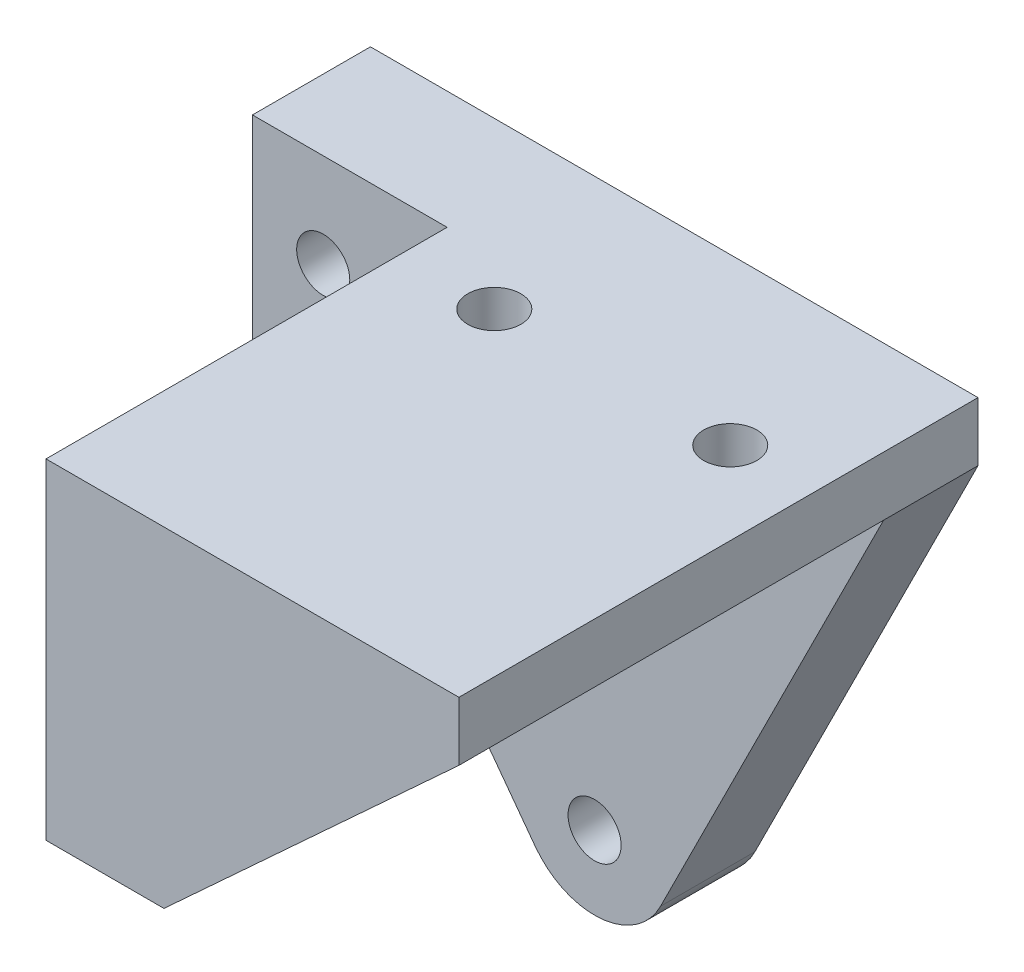
ISO-10303-21;
HEADER;
FILE_DESCRIPTION(('STEP AP214'),'2;1');
FILE_NAME('part.step','',(''),(''),'','','');
FILE_SCHEMA(('AUTOMOTIVE_DESIGN { 1 0 10303 214 1 1 1 1 }'));
ENDSEC;
DATA;
#1=APPLICATION_CONTEXT('core data for automotive mechanical design processes');
#2=APPLICATION_PROTOCOL_DEFINITION('international standard','automotive_design',2000,#1);
#3=PRODUCT_CONTEXT('',#1,'mechanical');
#4=PRODUCT('Part','Part','',(#3));
#5=PRODUCT_RELATED_PRODUCT_CATEGORY('part','',(#4));
#6=PRODUCT_DEFINITION_FORMATION('','',#4);
#7=PRODUCT_DEFINITION_CONTEXT('part definition',#1,'design');
#8=PRODUCT_DEFINITION('design','',#6,#7);
#9=PRODUCT_DEFINITION_SHAPE('','',#8);
#10=(LENGTH_UNIT() NAMED_UNIT(*) SI_UNIT(.MILLI.,.METRE.));
#11=(NAMED_UNIT(*) PLANE_ANGLE_UNIT() SI_UNIT($,.RADIAN.));
#12=(NAMED_UNIT(*) SI_UNIT($,.STERADIAN.) SOLID_ANGLE_UNIT());
#13=UNCERTAINTY_MEASURE_WITH_UNIT(LENGTH_MEASURE(1.E-05),#10,'distance_accuracy_value','');
#14=(GEOMETRIC_REPRESENTATION_CONTEXT(3) GLOBAL_UNCERTAINTY_ASSIGNED_CONTEXT((#13)) GLOBAL_UNIT_ASSIGNED_CONTEXT((#10,
#11,#12)) REPRESENTATION_CONTEXT('',''));
#15=CARTESIAN_POINT('',(0.,0.,0.));
#16=DIRECTION('',(0.,0.,1.));
#17=DIRECTION('',(1.,0.,0.));
#18=AXIS2_PLACEMENT_3D('',#15,#16,#17);
#19=CARTESIAN_POINT('',(0.,28.,0.));
#20=DIRECTION('',(-1.,0.,0.));
#21=DIRECTION('',(0.,0.,-1.));
#22=AXIS2_PLACEMENT_3D('',#19,#20,#21);
#23=PLANE('',#22);
#24=CARTESIAN_POINT('',(0.,17.5,34.));
#25=DIRECTION('',(-1.,0.,0.));
#26=DIRECTION('',(0.,0.,1.));
#27=AXIS2_PLACEMENT_3D('',#24,#25,#26);
#28=CIRCLE('',#27,2.25);
#29=CARTESIAN_POINT('',(0.,17.5,36.25));
#30=VERTEX_POINT('',#29);
#31=EDGE_CURVE('E263',#30,#30,#28,.T.);
#32=ORIENTED_EDGE('',*,*,#31,.T.);
#33=EDGE_LOOP('',(#32));
#34=FACE_BOUND('',#33,.T.);
#35=DIRECTION('',(0.,-1.,0.));
#36=VECTOR('',#35,1.);
#37=CARTESIAN_POINT('',(0.,23.,8.));
#38=LINE('',#37,#36);
#39=CARTESIAN_POINT('',(0.,23.,8.));
#40=VERTEX_POINT('',#39);
#41=CARTESIAN_POINT('',(0.,0.,8.));
#42=VERTEX_POINT('',#41);
#43=EDGE_CURVE('E357',#40,#42,#38,.T.);
#44=ORIENTED_EDGE('',*,*,#43,.F.);
#45=DIRECTION('',(0.,0.,1.));
#46=VECTOR('',#45,1.);
#47=CARTESIAN_POINT('',(0.,23.,0.));
#48=LINE('',#47,#46);
#49=CARTESIAN_POINT('',(0.,23.,10.5));
#50=VERTEX_POINT('',#49);
#51=EDGE_CURVE('E255',#40,#50,#48,.T.);
#52=ORIENTED_EDGE('',*,*,#51,.T.);
#53=DIRECTION('',(0.,-1.,0.));
#54=VECTOR('',#53,1.);
#55=CARTESIAN_POINT('',(0.,23.,10.5));
#56=LINE('',#55,#54);
#57=CARTESIAN_POINT('',(0.,18.,10.5));
#58=VERTEX_POINT('',#57);
#59=EDGE_CURVE('E219',#50,#58,#56,.T.);
#60=ORIENTED_EDGE('',*,*,#59,.T.);
#61=DIRECTION('',(0.,0.,1.));
#62=VECTOR('',#61,1.);
#63=CARTESIAN_POINT('',(0.,18.,10.5));
#64=LINE('',#63,#62);
#65=CARTESIAN_POINT('',(0.,18.,12.9692235935956));
#66=VERTEX_POINT('',#65);
#67=EDGE_CURVE('E224',#58,#66,#64,.T.);
#68=ORIENTED_EDGE('',*,*,#67,.T.);
#69=DIRECTION('',(0.,-1.,0.));
#70=VECTOR('',#69,1.);
#71=CARTESIAN_POINT('',(0.,28.00005,12.9692235935956));
#72=LINE('',#71,#70);
#73=CARTESIAN_POINT('',(0.,13.,12.9692235935956));
#74=VERTEX_POINT('',#73);
#75=EDGE_CURVE('E241',#74,#66,#72,.F.);
#76=ORIENTED_EDGE('',*,*,#75,.F.);
#77=DIRECTION('',(0.,0.,-1.));
#78=VECTOR('',#77,1.);
#79=CARTESIAN_POINT('',(0.,13.,0.));
#80=LINE('',#79,#78);
#81=CARTESIAN_POINT('',(0.,13.,15.0307764064044));
#82=VERTEX_POINT('',#81);
#83=EDGE_CURVE('E40',#82,#74,#80,.T.);
#84=ORIENTED_EDGE('',*,*,#83,.F.);
#85=DIRECTION('',(0.,-1.,0.));
#86=VECTOR('',#85,1.);
#87=CARTESIAN_POINT('',(0.,28.00005,15.0307764064044));
#88=LINE('',#87,#86);
#89=CARTESIAN_POINT('',(0.,18.,15.0307764064044));
#90=VERTEX_POINT('',#89);
#91=EDGE_CURVE('E244',#90,#82,#88,.T.);
#92=ORIENTED_EDGE('',*,*,#91,.F.);
#93=CARTESIAN_POINT('',(0.,18.,17.5));
#94=VERTEX_POINT('',#93);
#95=EDGE_CURVE('E222',#90,#94,#64,.T.);
#96=ORIENTED_EDGE('',*,*,#95,.T.);
#97=DIRECTION('',(0.,1.,0.));
#98=VECTOR('',#97,1.);
#99=CARTESIAN_POINT('',(0.,23.,17.5));
#100=LINE('',#99,#98);
#101=CARTESIAN_POINT('',(0.,23.,17.5));
#102=VERTEX_POINT('',#101);
#103=EDGE_CURVE('E211',#94,#102,#100,.T.);
#104=ORIENTED_EDGE('',*,*,#103,.T.);
#105=CARTESIAN_POINT('',(0.,23.,40.));
#106=VERTEX_POINT('',#105);
#107=EDGE_CURVE('E250',#102,#106,#48,.T.);
#108=ORIENTED_EDGE('',*,*,#107,.T.);
#109=DIRECTION('',(0.,-1.,0.));
#110=VECTOR('',#109,1.);
#111=CARTESIAN_POINT('',(0.,28.,40.));
#112=LINE('',#111,#110);
#113=CARTESIAN_POINT('',(0.,0.,40.));
#114=VERTEX_POINT('',#113);
#115=EDGE_CURVE('E276',#106,#114,#112,.T.);
#116=ORIENTED_EDGE('',*,*,#115,.T.);
#117=DIRECTION('',(0.,0.,1.));
#118=VECTOR('',#117,1.);
#119=CARTESIAN_POINT('',(0.,0.,0.));
#120=LINE('',#119,#118);
#121=EDGE_CURVE('E296',#42,#114,#120,.T.);
#122=ORIENTED_EDGE('',*,*,#121,.F.);
#123=EDGE_LOOP('',(#44,#52,#60,#68,#76,#84,#92,#96,#104,#108,#116,#122));
#124=FACE_BOUND('',#123,.T.);
#125=ADVANCED_FACE('F32',(#34,#124),#23,.F.);
#126=CARTESIAN_POINT('',(0.,0.,0.));
#127=DIRECTION('',(0.,1.,0.));
#128=DIRECTION('',(0.,0.,-1.));
#129=AXIS2_PLACEMENT_3D('',#126,#127,#128);
#130=PLANE('',#129);
#131=DIRECTION('',(-1.,0.,0.));
#132=VECTOR('',#131,1.);
#133=CARTESIAN_POINT('',(0.,0.,8.));
#134=LINE('',#133,#132);
#135=CARTESIAN_POINT('',(-26.5,0.,8.00000000000001));
#136=VERTEX_POINT('',#135);
#137=EDGE_CURVE('E360',#42,#136,#134,.T.);
#138=ORIENTED_EDGE('',*,*,#137,.F.);
#139=ORIENTED_EDGE('',*,*,#121,.T.);
#140=DIRECTION('',(0.,0.,-1.));
#141=VECTOR('',#140,1.);
#142=CARTESIAN_POINT('',(0.,0.,44.));
#143=LINE('',#142,#141);
#144=CARTESIAN_POINT('',(0.,0.,44.));
#145=VERTEX_POINT('',#144);
#146=EDGE_CURVE('E326',#145,#114,#143,.T.);
#147=ORIENTED_EDGE('',*,*,#146,.F.);
#148=DIRECTION('',(-1.,0.,0.));
#149=VECTOR('',#148,1.);
#150=CARTESIAN_POINT('',(0.,0.,44.));
#151=LINE('',#150,#149);
#152=CARTESIAN_POINT('',(-9.99999999999999,0.,44.));
#153=VERTEX_POINT('',#152);
#154=EDGE_CURVE('E324',#145,#153,#151,.T.);
#155=ORIENTED_EDGE('',*,*,#154,.T.);
#156=DIRECTION('',(0.,0.,-1.));
#157=VECTOR('',#156,1.);
#158=CARTESIAN_POINT('',(-9.99999999999999,0.,40.));
#159=LINE('',#158,#157);
#160=CARTESIAN_POINT('',(-9.99999999999999,0.,10.));
#161=VERTEX_POINT('',#160);
#162=EDGE_CURVE('E299',#153,#161,#159,.T.);
#163=ORIENTED_EDGE('',*,*,#162,.T.);
#164=DIRECTION('',(-1.,0.,0.));
#165=VECTOR('',#164,1.);
#166=CARTESIAN_POINT('',(-26.5,0.,10.));
#167=LINE('',#166,#165);
#168=CARTESIAN_POINT('',(-26.5,0.,10.));
#169=VERTEX_POINT('',#168);
#170=EDGE_CURVE('E303',#161,#169,#167,.T.);
#171=ORIENTED_EDGE('',*,*,#170,.T.);
#172=DIRECTION('',(0.,0.,-1.));
#173=VECTOR('',#172,1.);
#174=CARTESIAN_POINT('',(-26.5,0.,0.));
#175=LINE('',#174,#173);
#176=EDGE_CURVE('E306',#169,#136,#175,.T.);
#177=ORIENTED_EDGE('',*,*,#176,.T.);
#178=EDGE_LOOP('',(#138,#139,#147,#155,#163,#171,#177));
#179=FACE_BOUND('',#178,.T.);
#180=ADVANCED_FACE('F321',(#179),#130,.F.);
#181=CARTESIAN_POINT('',(25.,23.,0.));
#182=DIRECTION('',(0.,1.,0.));
#183=DIRECTION('',(0.,0.,-1.));
#184=AXIS2_PLACEMENT_3D('',#181,#182,#183);
#185=PLANE('',#184);
#186=CARTESIAN_POINT('',(-1.99999999999999,23.,14.));
#187=DIRECTION('',(0.,-1.,0.));
#188=DIRECTION('',(0.,0.,-1.));
#189=AXIS2_PLACEMENT_3D('',#186,#187,#188);
#190=CIRCLE('',#189,2.25);
#191=CARTESIAN_POINT('',(-1.99999999999999,23.,11.75));
#192=VERTEX_POINT('',#191);
#193=EDGE_CURVE('E273',#192,#192,#190,.T.);
#194=ORIENTED_EDGE('',*,*,#193,.F.);
#195=EDGE_LOOP('',(#194));
#196=FACE_BOUND('',#195,.T.);
#197=CARTESIAN_POINT('',(18.,23.,14.));
#198=DIRECTION('',(0.,-1.,0.));
#199=DIRECTION('',(0.,0.,-1.));
#200=AXIS2_PLACEMENT_3D('',#197,#198,#199);
#201=CIRCLE('',#200,2.25);
#202=CARTESIAN_POINT('',(18.,23.,11.75));
#203=VERTEX_POINT('',#202);
#204=EDGE_CURVE('E231',#203,#203,#201,.T.);
#205=ORIENTED_EDGE('',*,*,#204,.F.);
#206=EDGE_LOOP('',(#205));
#207=FACE_BOUND('',#206,.T.);
#208=DIRECTION('',(-1.,0.,0.));
#209=VECTOR('',#208,1.);
#210=CARTESIAN_POINT('',(25.,23.,7.99999999999999));
#211=LINE('',#210,#209);
#212=CARTESIAN_POINT('',(25.,23.,7.99999999999999));
#213=VERTEX_POINT('',#212);
#214=EDGE_CURVE('E355',#213,#40,#211,.T.);
#215=ORIENTED_EDGE('',*,*,#214,.F.);
#216=DIRECTION('',(0.,0.,1.));
#217=VECTOR('',#216,1.);
#218=CARTESIAN_POINT('',(25.,23.,0.));
#219=LINE('',#218,#217);
#220=CARTESIAN_POINT('',(25.,23.,40.));
#221=VERTEX_POINT('',#220);
#222=EDGE_CURVE('E254',#213,#221,#219,.T.);
#223=ORIENTED_EDGE('',*,*,#222,.T.);
#224=DIRECTION('',(-1.,0.,0.));
#225=VECTOR('',#224,1.);
#226=CARTESIAN_POINT('',(25.,23.,40.));
#227=LINE('',#226,#225);
#228=EDGE_CURVE('E260',#221,#106,#227,.T.);
#229=ORIENTED_EDGE('',*,*,#228,.T.);
#230=ORIENTED_EDGE('',*,*,#107,.F.);
#231=DIRECTION('',(1.,0.,0.));
#232=VECTOR('',#231,1.);
#233=CARTESIAN_POINT('',(-9.99999999999999,23.,17.5));
#234=LINE('',#233,#232);
#235=CARTESIAN_POINT('',(-9.99999999999999,23.,17.5));
#236=VERTEX_POINT('',#235);
#237=EDGE_CURVE('E232',#236,#102,#234,.T.);
#238=ORIENTED_EDGE('',*,*,#237,.F.);
#239=DIRECTION('',(0.,0.,-1.));
#240=VECTOR('',#239,1.);
#241=CARTESIAN_POINT('',(-10.,23.,10.5));
#242=LINE('',#241,#240);
#243=CARTESIAN_POINT('',(-10.,23.,10.5));
#244=VERTEX_POINT('',#243);
#245=EDGE_CURVE('E215',#236,#244,#242,.T.);
#246=ORIENTED_EDGE('',*,*,#245,.T.);
#247=DIRECTION('',(1.,0.,0.));
#248=VECTOR('',#247,1.);
#249=CARTESIAN_POINT('',(-10.,23.,10.5));
#250=LINE('',#249,#248);
#251=EDGE_CURVE('E229',#244,#50,#250,.T.);
#252=ORIENTED_EDGE('',*,*,#251,.T.);
#253=ORIENTED_EDGE('',*,*,#51,.F.);
#254=EDGE_LOOP('',(#215,#223,#229,#230,#238,#246,#252,#253));
#255=FACE_BOUND('',#254,.T.);
#256=ADVANCED_FACE('F444',(#196,#207,#255),#185,.F.);
#257=CARTESIAN_POINT('',(-1.99999999999999,28.00005,14.));
#258=DIRECTION('',(0.,-1.,0.));
#259=DIRECTION('',(0.,0.,1.));
#260=AXIS2_PLACEMENT_3D('',#257,#258,#259);
#261=CYLINDRICAL_SURFACE('',#260,2.25);
#262=CARTESIAN_POINT('',(-1.99999999999999,28.,14.));
#263=DIRECTION('',(0.,-1.,0.));
#264=DIRECTION('',(0.,0.,-1.));
#265=AXIS2_PLACEMENT_3D('',#262,#263,#264);
#266=CIRCLE('',#265,2.25);
#267=CARTESIAN_POINT('',(-1.99999999999999,28.,11.75));
#268=VERTEX_POINT('',#267);
#269=EDGE_CURVE('E247',#268,#268,#266,.T.);
#270=ORIENTED_EDGE('',*,*,#269,.F.);
#271=EDGE_LOOP('',(#270));
#272=FACE_BOUND('',#271,.T.);
#273=ORIENTED_EDGE('',*,*,#193,.T.);
#274=EDGE_LOOP('',(#273));
#275=FACE_BOUND('',#274,.T.);
#276=ADVANCED_FACE('F449',(#272,#275),#261,.F.);
#277=CARTESIAN_POINT('',(-9.99999999999999,28.,40.));
#278=DIRECTION('',(1.,0.,0.));
#279=DIRECTION('',(0.,0.,1.));
#280=AXIS2_PLACEMENT_3D('',#277,#278,#279);
#281=PLANE('',#280);
#282=ORIENTED_EDGE('',*,*,#245,.F.);
#283=DIRECTION('',(0.,1.,0.));
#284=VECTOR('',#283,1.);
#285=CARTESIAN_POINT('',(-9.99999999999999,23.,17.5));
#286=LINE('',#285,#284);
#287=CARTESIAN_POINT('',(-9.99999999999999,18.,17.5));
#288=VERTEX_POINT('',#287);
#289=EDGE_CURVE('E213',#288,#236,#286,.T.);
#290=ORIENTED_EDGE('',*,*,#289,.F.);
#291=DIRECTION('',(0.,0.,1.));
#292=VECTOR('',#291,1.);
#293=CARTESIAN_POINT('',(-10.,18.,10.5));
#294=LINE('',#293,#292);
#295=CARTESIAN_POINT('',(-10.,18.,10.5));
#296=VERTEX_POINT('',#295);
#297=EDGE_CURVE('E210',#296,#288,#294,.T.);
#298=ORIENTED_EDGE('',*,*,#297,.F.);
#299=DIRECTION('',(0.,-1.,0.));
#300=VECTOR('',#299,1.);
#301=CARTESIAN_POINT('',(-10.,23.,10.5));
#302=LINE('',#301,#300);
#303=EDGE_CURVE('E207',#244,#296,#302,.T.);
#304=ORIENTED_EDGE('',*,*,#303,.F.);
#305=EDGE_LOOP('',(#282,#290,#298,#304));
#306=FACE_BOUND('',#305,.T.);
#307=CARTESIAN_POINT('',(-9.99999999999999,17.5,34.));
#308=DIRECTION('',(-1.,0.,0.));
#309=DIRECTION('',(0.,0.,1.));
#310=AXIS2_PLACEMENT_3D('',#307,#308,#309);
#311=CIRCLE('',#310,2.25);
#312=CARTESIAN_POINT('',(-9.99999999999999,17.5,36.25));
#313=VERTEX_POINT('',#312);
#314=EDGE_CURVE('E284',#313,#313,#311,.T.);
#315=ORIENTED_EDGE('',*,*,#314,.F.);
#316=EDGE_LOOP('',(#315));
#317=FACE_BOUND('',#316,.T.);
#318=ORIENTED_EDGE('',*,*,#162,.F.);
#319=DIRECTION('',(0.,1.,0.));
#320=VECTOR('',#319,1.);
#321=CARTESIAN_POINT('',(-9.99999999999999,0.,44.));
#322=LINE('',#321,#320);
#323=CARTESIAN_POINT('',(-9.99999999999999,28.,44.));
#324=VERTEX_POINT('',#323);
#325=EDGE_CURVE('E328',#153,#324,#322,.T.);
#326=ORIENTED_EDGE('',*,*,#325,.T.);
#327=DIRECTION('',(0.,0.,-1.));
#328=VECTOR('',#327,1.);
#329=CARTESIAN_POINT('',(-9.99999999999999,28.,40.));
#330=LINE('',#329,#328);
#331=CARTESIAN_POINT('',(-9.99999999999999,28.,10.));
#332=VERTEX_POINT('',#331);
#333=EDGE_CURVE('E307',#324,#332,#330,.T.);
#334=ORIENTED_EDGE('',*,*,#333,.T.);
#335=DIRECTION('',(0.,-1.,0.));
#336=VECTOR('',#335,1.);
#337=CARTESIAN_POINT('',(-9.99999999999999,28.,10.));
#338=LINE('',#337,#336);
#339=EDGE_CURVE('E283',#332,#161,#338,.T.);
#340=ORIENTED_EDGE('',*,*,#339,.T.);
#341=EDGE_LOOP('',(#318,#326,#334,#340));
#342=FACE_BOUND('',#341,.T.);
#343=ADVANCED_FACE('F315',(#306,#317,#342),#281,.F.);
#344=CARTESIAN_POINT('',(-26.5,28.,10.));
#345=DIRECTION('',(0.,0.,-1.));
#346=DIRECTION('',(1.,0.,0.));
#347=AXIS2_PLACEMENT_3D('',#344,#345,#346);
#348=PLANE('',#347);
#349=CARTESIAN_POINT('',(-20.5,4.,10.));
#350=DIRECTION('',(0.,0.,1.));
#351=DIRECTION('',(1.,0.,0.));
#352=AXIS2_PLACEMENT_3D('',#349,#350,#351);
#353=CIRCLE('',#352,2.25);
#354=CARTESIAN_POINT('',(-18.25,4.,10.));
#355=VERTEX_POINT('',#354);
#356=EDGE_CURVE('E415',#355,#355,#353,.T.);
#357=ORIENTED_EDGE('',*,*,#356,.F.);
#358=EDGE_LOOP('',(#357));
#359=FACE_BOUND('',#358,.T.);
#360=CARTESIAN_POINT('',(-20.5,20.,10.));
#361=DIRECTION('',(0.,0.,1.));
#362=DIRECTION('',(1.,0.,0.));
#363=AXIS2_PLACEMENT_3D('',#360,#361,#362);
#364=CIRCLE('',#363,2.25);
#365=CARTESIAN_POINT('',(-18.25,20.,10.));
#366=VERTEX_POINT('',#365);
#367=EDGE_CURVE('E300',#366,#366,#364,.T.);
#368=ORIENTED_EDGE('',*,*,#367,.F.);
#369=EDGE_LOOP('',(#368));
#370=FACE_BOUND('',#369,.T.);
#371=ORIENTED_EDGE('',*,*,#170,.F.);
#372=ORIENTED_EDGE('',*,*,#339,.F.);
#373=DIRECTION('',(-1.,0.,0.));
#374=VECTOR('',#373,1.);
#375=CARTESIAN_POINT('',(-26.5,28.,10.));
#376=LINE('',#375,#374);
#377=CARTESIAN_POINT('',(-26.5,28.,10.));
#378=VERTEX_POINT('',#377);
#379=EDGE_CURVE('E411',#332,#378,#376,.T.);
#380=ORIENTED_EDGE('',*,*,#379,.T.);
#381=DIRECTION('',(0.,-1.,0.));
#382=VECTOR('',#381,1.);
#383=CARTESIAN_POINT('',(-26.5,28.,10.));
#384=LINE('',#383,#382);
#385=EDGE_CURVE('E291',#378,#169,#384,.T.);
#386=ORIENTED_EDGE('',*,*,#385,.T.);
#387=EDGE_LOOP('',(#371,#372,#380,#386));
#388=FACE_BOUND('',#387,.T.);
#389=ADVANCED_FACE('F319',(#359,#370,#388),#348,.F.);
#390=CARTESIAN_POINT('',(-26.5,28.,0.));
#391=DIRECTION('',(1.,0.,0.));
#392=DIRECTION('',(0.,0.,1.));
#393=AXIS2_PLACEMENT_3D('',#390,#391,#392);
#394=PLANE('',#393);
#395=DIRECTION('',(0.,0.,-1.));
#396=VECTOR('',#395,1.);
#397=CARTESIAN_POINT('',(-26.5,0.,8.00000000000001));
#398=LINE('',#397,#396);
#399=CARTESIAN_POINT('',(-26.5,0.,0.));
#400=VERTEX_POINT('',#399);
#401=EDGE_CURVE('E189',#136,#400,#398,.T.);
#402=ORIENTED_EDGE('',*,*,#401,.F.);
#403=ORIENTED_EDGE('',*,*,#176,.F.);
#404=ORIENTED_EDGE('',*,*,#385,.F.);
#405=DIRECTION('',(0.,0.,-1.));
#406=VECTOR('',#405,1.);
#407=CARTESIAN_POINT('',(-26.5,28.,0.));
#408=LINE('',#407,#406);
#409=CARTESIAN_POINT('',(-26.5,28.,0.));
#410=VERTEX_POINT('',#409);
#411=EDGE_CURVE('E192',#378,#410,#408,.T.);
#412=ORIENTED_EDGE('',*,*,#411,.T.);
#413=DIRECTION('',(0.,1.,0.));
#414=VECTOR('',#413,1.);
#415=CARTESIAN_POINT('',(-26.5,28.,0.));
#416=LINE('',#415,#414);
#417=EDGE_CURVE('E175',#400,#410,#416,.T.);
#418=ORIENTED_EDGE('',*,*,#417,.F.);
#419=EDGE_LOOP('',(#402,#403,#404,#412,#418));
#420=FACE_BOUND('',#419,.T.);
#421=ADVANCED_FACE('F187',(#420),#394,.F.);
#422=CARTESIAN_POINT('',(0.,28.,0.));
#423=DIRECTION('',(0.,0.,1.));
#424=DIRECTION('',(-1.,0.,0.));
#425=AXIS2_PLACEMENT_3D('',#422,#423,#424);
#426=PLANE('',#425);
#427=ORIENTED_EDGE('',*,*,#417,.T.);
#428=DIRECTION('',(1.,0.,0.));
#429=VECTOR('',#428,1.);
#430=CARTESIAN_POINT('',(0.,28.,0.));
#431=LINE('',#430,#429);
#432=CARTESIAN_POINT('',(25.,28.,0.));
#433=VERTEX_POINT('',#432);
#434=EDGE_CURVE('E289',#410,#433,#431,.T.);
#435=ORIENTED_EDGE('',*,*,#434,.T.);
#436=DIRECTION('',(0.,-1.,0.));
#437=VECTOR('',#436,1.);
#438=CARTESIAN_POINT('',(25.,28.,0.));
#439=LINE('',#438,#437);
#440=CARTESIAN_POINT('',(25.,23.,0.));
#441=VERTEX_POINT('',#440);
#442=EDGE_CURVE('E251',#433,#441,#439,.T.);
#443=ORIENTED_EDGE('',*,*,#442,.T.);
#444=DIRECTION('',(0.447446175622787,0.894310863134594,0.));
#445=VECTOR('',#444,1.);
#446=CARTESIAN_POINT('',(6.08944289459122,-14.7965385976424,0.));
#447=LINE('',#446,#445);
#448=CARTESIAN_POINT('',(6.08944289459122,-14.7965385976424,0.));
#449=VERTEX_POINT('',#448);
#450=EDGE_CURVE('E183',#449,#441,#447,.T.);
#451=ORIENTED_EDGE('',*,*,#450,.F.);
#452=CARTESIAN_POINT('',(0.500000000000007,-12.,0.));
#453=DIRECTION('',(0.,0.,1.));
#454=DIRECTION('',(1.,0.,0.));
#455=AXIS2_PLACEMENT_3D('',#452,#453,#454);
#456=CIRCLE('',#455,6.25);
#457=CARTESIAN_POINT('',(-4.5222817101787,-15.7201057005957,0.));
#458=VERTEX_POINT('',#457);
#459=EDGE_CURVE('E348',#458,#449,#456,.T.);
#460=ORIENTED_EDGE('',*,*,#459,.F.);
#461=DIRECTION('',(0.595216912095308,-0.803565073628593,0.));
#462=VECTOR('',#461,1.);
#463=CARTESIAN_POINT('',(-9.49999999999999,-9.,0.));
#464=LINE('',#463,#462);
#465=CARTESIAN_POINT('',(-9.49999999999999,-9.,0.));
#466=VERTEX_POINT('',#465);
#467=EDGE_CURVE('E353',#466,#458,#464,.T.);
#468=ORIENTED_EDGE('',*,*,#467,.F.);
#469=CARTESIAN_POINT('',(-12.7142602945144,-11.3808676483812,0.));
#470=DIRECTION('',(0.,0.,-1.));
#471=DIRECTION('',(-1.,0.,0.));
#472=AXIS2_PLACEMENT_3D('',#469,#470,#471);
#473=CIRCLE('',#472,4.);
#474=CARTESIAN_POINT('',(-10.9224930112807,-7.80461681786982,0.));
#475=VERTEX_POINT('',#474);
#476=EDGE_CURVE('E179',#475,#466,#473,.T.);
#477=ORIENTED_EDGE('',*,*,#476,.F.);
#478=DIRECTION('',(0.894062707627854,-0.447941820808406,0.));
#479=VECTOR('',#478,1.);
#480=CARTESIAN_POINT('',(-26.5,0.,0.));
#481=LINE('',#480,#479);
#482=EDGE_CURVE('E170',#400,#475,#481,.T.);
#483=ORIENTED_EDGE('',*,*,#482,.F.);
#484=EDGE_LOOP('',(#427,#435,#443,#451,#460,#468,#477,#483));
#485=FACE_BOUND('',#484,.T.);
#486=CARTESIAN_POINT('',(0.500000000000006,-12.,0.));
#487=DIRECTION('',(0.,0.,1.));
#488=DIRECTION('',(1.,0.,0.));
#489=AXIS2_PLACEMENT_3D('',#486,#487,#488);
#490=CIRCLE('',#489,2.25);
#491=CARTESIAN_POINT('',(2.75000000000001,-12.,0.));
#492=VERTEX_POINT('',#491);
#493=EDGE_CURVE('E344',#492,#492,#490,.T.);
#494=ORIENTED_EDGE('',*,*,#493,.T.);
#495=EDGE_LOOP('',(#494));
#496=FACE_BOUND('',#495,.T.);
#497=CARTESIAN_POINT('',(-20.5,20.,0.));
#498=DIRECTION('',(0.,0.,-1.));
#499=DIRECTION('',(-1.,0.,0.));
#500=AXIS2_PLACEMENT_3D('',#497,#498,#499);
#501=CIRCLE('',#500,2.25);
#502=CARTESIAN_POINT('',(-18.25,20.,0.));
#503=VERTEX_POINT('',#502);
#504=EDGE_CURVE('E194',#503,#503,#501,.F.);
#505=ORIENTED_EDGE('',*,*,#504,.T.);
#506=EDGE_LOOP('',(#505));
#507=FACE_BOUND('',#506,.T.);
#508=CARTESIAN_POINT('',(-20.5,4.,0.));
#509=DIRECTION('',(0.,0.,-1.));
#510=DIRECTION('',(-1.,0.,0.));
#511=AXIS2_PLACEMENT_3D('',#508,#509,#510);
#512=CIRCLE('',#511,2.25);
#513=CARTESIAN_POINT('',(-18.25,4.,0.));
#514=VERTEX_POINT('',#513);
#515=EDGE_CURVE('E35',#514,#514,#512,.F.);
#516=ORIENTED_EDGE('',*,*,#515,.T.);
#517=EDGE_LOOP('',(#516));
#518=FACE_BOUND('',#517,.T.);
#519=ADVANCED_FACE('F172',(#485,#496,#507,#518),#426,.F.);
#520=CARTESIAN_POINT('',(0.,28.,0.));
#521=DIRECTION('',(0.,1.,0.));
#522=DIRECTION('',(0.,0.,-1.));
#523=AXIS2_PLACEMENT_3D('',#520,#521,#522);
#524=PLANE('',#523);
#525=ORIENTED_EDGE('',*,*,#411,.F.);
#526=ORIENTED_EDGE('',*,*,#379,.F.);
#527=ORIENTED_EDGE('',*,*,#333,.F.);
#528=DIRECTION('',(1.,0.,0.));
#529=VECTOR('',#528,1.);
#530=CARTESIAN_POINT('',(-9.99999999999999,28.,44.));
#531=LINE('',#530,#529);
#532=CARTESIAN_POINT('',(25.,28.,44.));
#533=VERTEX_POINT('',#532);
#534=EDGE_CURVE('E331',#324,#533,#531,.T.);
#535=ORIENTED_EDGE('',*,*,#534,.T.);
#536=DIRECTION('',(0.,0.,-1.));
#537=VECTOR('',#536,1.);
#538=CARTESIAN_POINT('',(25.,28.,0.));
#539=LINE('',#538,#537);
#540=EDGE_CURVE('E258',#533,#433,#539,.T.);
#541=ORIENTED_EDGE('',*,*,#540,.T.);
#542=ORIENTED_EDGE('',*,*,#434,.F.);
#543=EDGE_LOOP('',(#525,#526,#527,#535,#541,#542));
#544=FACE_BOUND('',#543,.T.);
#545=CARTESIAN_POINT('',(18.,28.,14.));
#546=DIRECTION('',(0.,-1.,0.));
#547=DIRECTION('',(0.,0.,-1.));
#548=AXIS2_PLACEMENT_3D('',#545,#546,#547);
#549=CIRCLE('',#548,2.25);
#550=CARTESIAN_POINT('',(18.,28.,11.75));
#551=VERTEX_POINT('',#550);
#552=EDGE_CURVE('E236',#551,#551,#549,.T.);
#553=ORIENTED_EDGE('',*,*,#552,.T.);
#554=EDGE_LOOP('',(#553));
#555=FACE_BOUND('',#554,.T.);
#556=ORIENTED_EDGE('',*,*,#269,.T.);
#557=EDGE_LOOP('',(#556));
#558=FACE_BOUND('',#557,.T.);
#559=ADVANCED_FACE('F409',(#544,#555,#558),#524,.T.);
#560=CARTESIAN_POINT('',(-20.5,20.,40.));
#561=DIRECTION('',(0.,0.,-1.));
#562=DIRECTION('',(1.,0.,0.));
#563=AXIS2_PLACEMENT_3D('',#560,#561,#562);
#564=CYLINDRICAL_SURFACE('',#563,2.25);
#565=CARTESIAN_POINT('',(-18.25,20.,0.));
#566=CARTESIAN_POINT('',(-18.25,20.,0.104166666666667));
#567=CARTESIAN_POINT('',(-18.25,20.,0.208333333333334));
#568=CARTESIAN_POINT('',(-18.25,20.,0.416666666666667));
#569=CARTESIAN_POINT('',(-18.25,20.,0.520833333333334));
#570=CARTESIAN_POINT('',(-18.25,20.,0.729166666666667));
#571=CARTESIAN_POINT('',(-18.25,20.,0.833333333333334));
#572=CARTESIAN_POINT('',(-18.25,20.,1.04166666666667));
#573=CARTESIAN_POINT('',(-18.25,20.,1.14583333333333));
#574=CARTESIAN_POINT('',(-18.25,20.,1.35416666666667));
#575=CARTESIAN_POINT('',(-18.25,20.,1.45833333333333));
#576=CARTESIAN_POINT('',(-18.25,20.,1.66666666666667));
#577=CARTESIAN_POINT('',(-18.25,20.,1.77083333333334));
#578=CARTESIAN_POINT('',(-18.25,20.,1.97916666666667));
#579=CARTESIAN_POINT('',(-18.25,20.,2.08333333333334));
#580=CARTESIAN_POINT('',(-18.25,20.,2.29166666666667));
#581=CARTESIAN_POINT('',(-18.25,20.,2.39583333333334));
#582=CARTESIAN_POINT('',(-18.25,20.,2.60416666666667));
#583=CARTESIAN_POINT('',(-18.25,20.,2.70833333333334));
#584=CARTESIAN_POINT('',(-18.25,20.,2.91666666666667));
#585=CARTESIAN_POINT('',(-18.25,20.,3.02083333333334));
#586=CARTESIAN_POINT('',(-18.25,20.,3.22916666666667));
#587=CARTESIAN_POINT('',(-18.25,20.,3.33333333333334));
#588=CARTESIAN_POINT('',(-18.25,20.,3.54166666666667));
#589=CARTESIAN_POINT('',(-18.25,20.,3.64583333333334));
#590=CARTESIAN_POINT('',(-18.25,20.,3.85416666666667));
#591=CARTESIAN_POINT('',(-18.25,20.,3.95833333333334));
#592=CARTESIAN_POINT('',(-18.25,20.,4.16666666666667));
#593=CARTESIAN_POINT('',(-18.25,20.,4.27083333333334));
#594=CARTESIAN_POINT('',(-18.25,20.,4.47916666666667));
#595=CARTESIAN_POINT('',(-18.25,20.,4.58333333333334));
#596=CARTESIAN_POINT('',(-18.25,20.,4.79166666666667));
#597=CARTESIAN_POINT('',(-18.25,20.,4.89583333333334));
#598=CARTESIAN_POINT('',(-18.25,20.,5.10416666666667));
#599=CARTESIAN_POINT('',(-18.25,20.,5.20833333333334));
#600=CARTESIAN_POINT('',(-18.25,20.,5.41666666666667));
#601=CARTESIAN_POINT('',(-18.25,20.,5.52083333333334));
#602=CARTESIAN_POINT('',(-18.25,20.,5.72916666666667));
#603=CARTESIAN_POINT('',(-18.25,20.,5.83333333333334));
#604=CARTESIAN_POINT('',(-18.25,20.,6.04166666666667));
#605=CARTESIAN_POINT('',(-18.25,20.,6.14583333333334));
#606=CARTESIAN_POINT('',(-18.25,20.,6.35416666666667));
#607=CARTESIAN_POINT('',(-18.25,20.,6.45833333333334));
#608=CARTESIAN_POINT('',(-18.25,20.,6.66666666666667));
#609=CARTESIAN_POINT('',(-18.25,20.,6.77083333333334));
#610=CARTESIAN_POINT('',(-18.25,20.,6.97916666666667));
#611=CARTESIAN_POINT('',(-18.25,20.,7.08333333333334));
#612=CARTESIAN_POINT('',(-18.25,20.,7.29166666666667));
#613=CARTESIAN_POINT('',(-18.25,20.,7.39583333333334));
#614=CARTESIAN_POINT('',(-18.25,20.,7.60416666666667));
#615=CARTESIAN_POINT('',(-18.25,20.,7.70833333333334));
#616=CARTESIAN_POINT('',(-18.25,20.,7.91666666666667));
#617=CARTESIAN_POINT('',(-18.25,20.,8.02083333333334));
#618=CARTESIAN_POINT('',(-18.25,20.,8.22916666666667));
#619=CARTESIAN_POINT('',(-18.25,20.,8.33333333333334));
#620=CARTESIAN_POINT('',(-18.25,20.,8.54166666666667));
#621=CARTESIAN_POINT('',(-18.25,20.,8.64583333333334));
#622=CARTESIAN_POINT('',(-18.25,20.,8.85416666666667));
#623=CARTESIAN_POINT('',(-18.25,20.,8.95833333333334));
#624=CARTESIAN_POINT('',(-18.25,20.,9.16666666666667));
#625=CARTESIAN_POINT('',(-18.25,20.,9.27083333333334));
#626=CARTESIAN_POINT('',(-18.25,20.,9.47916666666667));
#627=CARTESIAN_POINT('',(-18.25,20.,9.58333333333334));
#628=CARTESIAN_POINT('',(-18.25,20.,9.79166666666667));
#629=CARTESIAN_POINT('',(-18.25,20.,9.89583333333334));
#630=CARTESIAN_POINT('',(-18.25,20.,10.));
#631=B_SPLINE_CURVE_WITH_KNOTS('',3,(#565,#566,#567,#568,#569,#570,#571,#572,#573,#574,#575,
#576,#577,#578,#579,#580,#581,#582,#583,#584,#585,#586,#587,#588,#589,#590,#591,#592,#593,#594,
#595,#596,#597,#598,#599,#600,#601,#602,#603,#604,#605,#606,#607,#608,#609,#610,#611,#612,#613,
#614,#615,#616,#617,#618,#619,#620,#621,#622,#623,#624,#625,#626,#627,#628,#629,#630),
.UNSPECIFIED.,.F.,.F.,(4,2,2,2,2,2,2,2,2,2,2,2,2,2,2,2,2,2,2,2,2,2,2,2,2,2,2,2,2,2,2,2,4),(0.,
0.3125,0.625000000000001,0.937500000000001,1.25,1.5625,1.875,2.1875,2.5,2.8125,3.125,3.4375,
3.75,4.0625,4.375,4.6875,5.,5.3125,5.62500000000001,5.93750000000001,6.25000000000001,
6.56250000000001,6.87500000000001,7.18750000000001,7.50000000000001,7.81250000000001,
8.12500000000001,8.43750000000001,8.75000000000001,9.06250000000001,9.37500000000001,
9.68750000000001,10.),.UNSPECIFIED.);
#632=EDGE_CURVE('BSEAM436',#503,#366,#631,.T.);
#633=ORIENTED_EDGE('',*,*,#504,.F.);
#634=ORIENTED_EDGE('',*,*,#367,.T.);
#635=ORIENTED_EDGE('',*,*,#632,.T.);
#636=ORIENTED_EDGE('',*,*,#632,.F.);
#637=EDGE_LOOP('',(#633,#635,#634,#636));
#638=FACE_BOUND('',#637,.T.);
#639=ADVANCED_FACE('F436',(#638),#564,.F.);
#640=CARTESIAN_POINT('',(-20.5,4.,40.));
#641=DIRECTION('',(0.,0.,-1.));
#642=DIRECTION('',(1.,0.,0.));
#643=AXIS2_PLACEMENT_3D('',#640,#641,#642);
#644=CYLINDRICAL_SURFACE('',#643,2.25);
#645=CARTESIAN_POINT('',(-18.25,4.,0.));
#646=CARTESIAN_POINT('',(-18.25,4.,0.104166666666667));
#647=CARTESIAN_POINT('',(-18.25,4.,0.208333333333334));
#648=CARTESIAN_POINT('',(-18.25,4.,0.416666666666667));
#649=CARTESIAN_POINT('',(-18.25,4.,0.520833333333334));
#650=CARTESIAN_POINT('',(-18.25,4.,0.729166666666667));
#651=CARTESIAN_POINT('',(-18.25,4.,0.833333333333334));
#652=CARTESIAN_POINT('',(-18.25,4.,1.04166666666667));
#653=CARTESIAN_POINT('',(-18.25,4.,1.14583333333333));
#654=CARTESIAN_POINT('',(-18.25,4.,1.35416666666667));
#655=CARTESIAN_POINT('',(-18.25,4.,1.45833333333333));
#656=CARTESIAN_POINT('',(-18.25,4.,1.66666666666667));
#657=CARTESIAN_POINT('',(-18.25,4.,1.77083333333334));
#658=CARTESIAN_POINT('',(-18.25,4.,1.97916666666667));
#659=CARTESIAN_POINT('',(-18.25,4.,2.08333333333334));
#660=CARTESIAN_POINT('',(-18.25,4.,2.29166666666667));
#661=CARTESIAN_POINT('',(-18.25,4.,2.39583333333334));
#662=CARTESIAN_POINT('',(-18.25,4.,2.60416666666667));
#663=CARTESIAN_POINT('',(-18.25,4.,2.70833333333334));
#664=CARTESIAN_POINT('',(-18.25,4.,2.91666666666667));
#665=CARTESIAN_POINT('',(-18.25,4.,3.02083333333334));
#666=CARTESIAN_POINT('',(-18.25,4.,3.22916666666667));
#667=CARTESIAN_POINT('',(-18.25,4.,3.33333333333334));
#668=CARTESIAN_POINT('',(-18.25,4.,3.54166666666667));
#669=CARTESIAN_POINT('',(-18.25,4.,3.64583333333334));
#670=CARTESIAN_POINT('',(-18.25,4.,3.85416666666667));
#671=CARTESIAN_POINT('',(-18.25,4.,3.95833333333334));
#672=CARTESIAN_POINT('',(-18.25,4.,4.16666666666667));
#673=CARTESIAN_POINT('',(-18.25,4.,4.27083333333334));
#674=CARTESIAN_POINT('',(-18.25,4.,4.47916666666667));
#675=CARTESIAN_POINT('',(-18.25,4.,4.58333333333334));
#676=CARTESIAN_POINT('',(-18.25,4.,4.79166666666667));
#677=CARTESIAN_POINT('',(-18.25,4.,4.89583333333334));
#678=CARTESIAN_POINT('',(-18.25,4.,5.10416666666667));
#679=CARTESIAN_POINT('',(-18.25,4.,5.20833333333334));
#680=CARTESIAN_POINT('',(-18.25,4.,5.41666666666667));
#681=CARTESIAN_POINT('',(-18.25,4.,5.52083333333334));
#682=CARTESIAN_POINT('',(-18.25,4.,5.72916666666667));
#683=CARTESIAN_POINT('',(-18.25,4.,5.83333333333334));
#684=CARTESIAN_POINT('',(-18.25,4.,6.04166666666667));
#685=CARTESIAN_POINT('',(-18.25,4.,6.14583333333334));
#686=CARTESIAN_POINT('',(-18.25,4.,6.35416666666667));
#687=CARTESIAN_POINT('',(-18.25,4.,6.45833333333334));
#688=CARTESIAN_POINT('',(-18.25,4.,6.66666666666667));
#689=CARTESIAN_POINT('',(-18.25,4.,6.77083333333334));
#690=CARTESIAN_POINT('',(-18.25,4.,6.97916666666667));
#691=CARTESIAN_POINT('',(-18.25,4.,7.08333333333334));
#692=CARTESIAN_POINT('',(-18.25,4.,7.29166666666667));
#693=CARTESIAN_POINT('',(-18.25,4.,7.39583333333334));
#694=CARTESIAN_POINT('',(-18.25,4.,7.60416666666667));
#695=CARTESIAN_POINT('',(-18.25,4.,7.70833333333334));
#696=CARTESIAN_POINT('',(-18.25,4.,7.91666666666667));
#697=CARTESIAN_POINT('',(-18.25,4.,8.02083333333334));
#698=CARTESIAN_POINT('',(-18.25,4.,8.22916666666667));
#699=CARTESIAN_POINT('',(-18.25,4.,8.33333333333334));
#700=CARTESIAN_POINT('',(-18.25,4.,8.54166666666667));
#701=CARTESIAN_POINT('',(-18.25,4.,8.64583333333334));
#702=CARTESIAN_POINT('',(-18.25,4.,8.85416666666667));
#703=CARTESIAN_POINT('',(-18.25,4.,8.95833333333334));
#704=CARTESIAN_POINT('',(-18.25,4.,9.16666666666667));
#705=CARTESIAN_POINT('',(-18.25,4.,9.27083333333334));
#706=CARTESIAN_POINT('',(-18.25,4.,9.47916666666667));
#707=CARTESIAN_POINT('',(-18.25,4.,9.58333333333334));
#708=CARTESIAN_POINT('',(-18.25,4.,9.79166666666667));
#709=CARTESIAN_POINT('',(-18.25,4.,9.89583333333334));
#710=CARTESIAN_POINT('',(-18.25,4.,10.));
#711=B_SPLINE_CURVE_WITH_KNOTS('',3,(#645,#646,#647,#648,#649,#650,#651,#652,#653,#654,#655,
#656,#657,#658,#659,#660,#661,#662,#663,#664,#665,#666,#667,#668,#669,#670,#671,#672,#673,#674,
#675,#676,#677,#678,#679,#680,#681,#682,#683,#684,#685,#686,#687,#688,#689,#690,#691,#692,#693,
#694,#695,#696,#697,#698,#699,#700,#701,#702,#703,#704,#705,#706,#707,#708,#709,#710),
.UNSPECIFIED.,.F.,.F.,(4,2,2,2,2,2,2,2,2,2,2,2,2,2,2,2,2,2,2,2,2,2,2,2,2,2,2,2,2,2,2,2,4),(0.,
0.3125,0.625000000000001,0.937500000000001,1.25,1.5625,1.875,2.1875,2.5,2.8125,3.125,3.4375,
3.75,4.0625,4.375,4.6875,5.,5.3125,5.62500000000001,5.93750000000001,6.25000000000001,
6.56250000000001,6.87500000000001,7.18750000000001,7.50000000000001,7.81250000000001,
8.12500000000001,8.43750000000001,8.75000000000001,9.06250000000001,9.37500000000001,
9.68750000000001,10.),.UNSPECIFIED.);
#712=EDGE_CURVE('BSEAM428',#514,#355,#711,.T.);
#713=ORIENTED_EDGE('',*,*,#515,.F.);
#714=ORIENTED_EDGE('',*,*,#356,.T.);
#715=ORIENTED_EDGE('',*,*,#712,.T.);
#716=ORIENTED_EDGE('',*,*,#712,.F.);
#717=EDGE_LOOP('',(#713,#715,#714,#716));
#718=FACE_BOUND('',#717,.T.);
#719=ADVANCED_FACE('F428',(#718),#644,.F.);
#720=CARTESIAN_POINT('',(-26.5,17.5,34.));
#721=DIRECTION('',(1.,0.,0.));
#722=DIRECTION('',(0.,0.,1.));
#723=AXIS2_PLACEMENT_3D('',#720,#721,#722);
#724=CYLINDRICAL_SURFACE('',#723,2.25);
#725=ORIENTED_EDGE('',*,*,#31,.F.);
#726=EDGE_LOOP('',(#725));
#727=FACE_BOUND('',#726,.T.);
#728=ORIENTED_EDGE('',*,*,#314,.T.);
#729=EDGE_LOOP('',(#728));
#730=FACE_BOUND('',#729,.T.);
#731=ADVANCED_FACE('F426',(#727,#730),#724,.F.);
#732=CARTESIAN_POINT('',(25.,0.,0.));
#733=DIRECTION('',(1.,0.,0.));
#734=DIRECTION('',(0.,0.,1.));
#735=AXIS2_PLACEMENT_3D('',#732,#733,#734);
#736=PLANE('',#735);
#737=ORIENTED_EDGE('',*,*,#442,.F.);
#738=ORIENTED_EDGE('',*,*,#540,.F.);
#739=DIRECTION('',(0.,-1.,0.));
#740=VECTOR('',#739,1.);
#741=CARTESIAN_POINT('',(25.,28.,44.));
#742=LINE('',#741,#740);
#743=CARTESIAN_POINT('',(25.,23.,44.));
#744=VERTEX_POINT('',#743);
#745=EDGE_CURVE('E333',#533,#744,#742,.T.);
#746=ORIENTED_EDGE('',*,*,#745,.T.);
#747=DIRECTION('',(0.,0.,-1.));
#748=VECTOR('',#747,1.);
#749=CARTESIAN_POINT('',(25.,23.,44.));
#750=LINE('',#749,#748);
#751=EDGE_CURVE('E341',#744,#221,#750,.T.);
#752=ORIENTED_EDGE('',*,*,#751,.T.);
#753=ORIENTED_EDGE('',*,*,#222,.F.);
#754=EDGE_CURVE('E256',#441,#213,#219,.T.);
#755=ORIENTED_EDGE('',*,*,#754,.F.);
#756=EDGE_LOOP('',(#737,#738,#746,#752,#753,#755));
#757=FACE_BOUND('',#756,.T.);
#758=ADVANCED_FACE('F407',(#757),#736,.T.);
#759=CARTESIAN_POINT('',(-1.99999999999999,13.,14.));
#760=DIRECTION('',(0.,-1.,0.));
#761=DIRECTION('',(0.,0.,1.));
#762=AXIS2_PLACEMENT_3D('',#759,#760,#761);
#763=PLANE('',#762);
#764=CARTESIAN_POINT('',(-1.99999999999999,13.,14.));
#765=DIRECTION('',(0.,1.,0.));
#766=DIRECTION('',(0.,0.,1.));
#767=AXIS2_PLACEMENT_3D('',#764,#765,#766);
#768=CIRCLE('',#767,2.25);
#769=EDGE_CURVE('E239',#74,#82,#768,.T.);
#770=ORIENTED_EDGE('',*,*,#769,.T.);
#771=ORIENTED_EDGE('',*,*,#83,.T.);
#772=EDGE_LOOP('',(#770,#771));
#773=FACE_BOUND('',#772,.T.);
#774=ADVANCED_FACE('F434',(#773),#763,.F.);
#775=ORIENTED_EDGE('',*,*,#91,.T.);
#776=ORIENTED_EDGE('',*,*,#769,.F.);
#777=ORIENTED_EDGE('',*,*,#75,.T.);
#778=CARTESIAN_POINT('',(-1.99999999999999,18.,14.));
#779=DIRECTION('',(0.,1.,0.));
#780=DIRECTION('',(0.,0.,1.));
#781=AXIS2_PLACEMENT_3D('',#778,#779,#780);
#782=CIRCLE('',#781,2.25);
#783=EDGE_CURVE('E11',#90,#66,#782,.F.);
#784=ORIENTED_EDGE('',*,*,#783,.F.);
#785=EDGE_LOOP('',(#775,#776,#777,#784));
#786=FACE_BOUND('',#785,.T.);
#787=ADVANCED_FACE('F467',(#786),#261,.F.);
#788=CARTESIAN_POINT('',(18.,28.00005,14.));
#789=DIRECTION('',(0.,-1.,0.));
#790=DIRECTION('',(0.,0.,1.));
#791=AXIS2_PLACEMENT_3D('',#788,#789,#790);
#792=CYLINDRICAL_SURFACE('',#791,2.25);
#793=ORIENTED_EDGE('',*,*,#552,.F.);
#794=EDGE_LOOP('',(#793));
#795=FACE_BOUND('',#794,.T.);
#796=ORIENTED_EDGE('',*,*,#204,.T.);
#797=EDGE_LOOP('',(#796));
#798=FACE_BOUND('',#797,.T.);
#799=ADVANCED_FACE('F496',(#795,#798),#792,.F.);
#800=CARTESIAN_POINT('',(-10.,18.,10.5));
#801=DIRECTION('',(0.,-1.,0.));
#802=DIRECTION('',(0.,0.,1.));
#803=AXIS2_PLACEMENT_3D('',#800,#801,#802);
#804=PLANE('',#803);
#805=ORIENTED_EDGE('',*,*,#95,.F.);
#806=ORIENTED_EDGE('',*,*,#783,.T.);
#807=ORIENTED_EDGE('',*,*,#67,.F.);
#808=DIRECTION('',(1.,0.,0.));
#809=VECTOR('',#808,1.);
#810=CARTESIAN_POINT('',(-10.,18.,10.5));
#811=LINE('',#810,#809);
#812=EDGE_CURVE('E218',#296,#58,#811,.T.);
#813=ORIENTED_EDGE('',*,*,#812,.F.);
#814=ORIENTED_EDGE('',*,*,#297,.T.);
#815=DIRECTION('',(1.,0.,0.));
#816=VECTOR('',#815,1.);
#817=CARTESIAN_POINT('',(-9.99999999999999,18.,17.5));
#818=LINE('',#817,#816);
#819=EDGE_CURVE('E56',#288,#94,#818,.T.);
#820=ORIENTED_EDGE('',*,*,#819,.T.);
#821=EDGE_LOOP('',(#805,#806,#807,#813,#814,#820));
#822=FACE_BOUND('',#821,.T.);
#823=ADVANCED_FACE('F482',(#822),#804,.F.);
#824=CARTESIAN_POINT('',(-10.,23.,10.5));
#825=DIRECTION('',(0.,0.,-1.));
#826=DIRECTION('',(1.,0.,0.));
#827=AXIS2_PLACEMENT_3D('',#824,#825,#826);
#828=PLANE('',#827);
#829=ORIENTED_EDGE('',*,*,#59,.F.);
#830=ORIENTED_EDGE('',*,*,#251,.F.);
#831=ORIENTED_EDGE('',*,*,#303,.T.);
#832=ORIENTED_EDGE('',*,*,#812,.T.);
#833=EDGE_LOOP('',(#829,#830,#831,#832));
#834=FACE_BOUND('',#833,.T.);
#835=ADVANCED_FACE('F486',(#834),#828,.F.);
#836=CARTESIAN_POINT('',(-9.99999999999999,23.,17.5));
#837=DIRECTION('',(0.,0.,1.));
#838=DIRECTION('',(-1.,0.,0.));
#839=AXIS2_PLACEMENT_3D('',#836,#837,#838);
#840=PLANE('',#839);
#841=ORIENTED_EDGE('',*,*,#103,.F.);
#842=ORIENTED_EDGE('',*,*,#819,.F.);
#843=ORIENTED_EDGE('',*,*,#289,.T.);
#844=ORIENTED_EDGE('',*,*,#237,.T.);
#845=EDGE_LOOP('',(#841,#842,#843,#844));
#846=FACE_BOUND('',#845,.T.);
#847=ADVANCED_FACE('F476',(#846),#840,.F.);
#848=CARTESIAN_POINT('',(0.500000000000009,-12.,8.));
#849=DIRECTION('',(0.,0.,-1.));
#850=DIRECTION('',(1.,0.,0.));
#851=AXIS2_PLACEMENT_3D('',#848,#849,#850);
#852=CYLINDRICAL_SURFACE('',#851,6.25);
#853=ORIENTED_EDGE('',*,*,#459,.T.);
#854=DIRECTION('',(0.,0.,-1.));
#855=VECTOR('',#854,1.);
#856=CARTESIAN_POINT('',(6.08944289459122,-14.7965385976424,8.));
#857=LINE('',#856,#855);
#858=CARTESIAN_POINT('',(6.08944289459122,-14.7965385976424,8.));
#859=VERTEX_POINT('',#858);
#860=EDGE_CURVE('E199',#859,#449,#857,.T.);
#861=ORIENTED_EDGE('',*,*,#860,.F.);
#862=CARTESIAN_POINT('',(0.500000000000009,-12.,8.));
#863=DIRECTION('',(0.,0.,1.));
#864=DIRECTION('',(1.,0.,0.));
#865=AXIS2_PLACEMENT_3D('',#862,#863,#864);
#866=CIRCLE('',#865,6.25);
#867=CARTESIAN_POINT('',(-4.5222817101787,-15.7201057005957,8.));
#868=VERTEX_POINT('',#867);
#869=EDGE_CURVE('E351',#868,#859,#866,.T.);
#870=ORIENTED_EDGE('',*,*,#869,.F.);
#871=DIRECTION('',(0.,0.,-1.));
#872=VECTOR('',#871,1.);
#873=CARTESIAN_POINT('',(-4.5222817101787,-15.7201057005957,8.));
#874=LINE('',#873,#872);
#875=EDGE_CURVE('E223',#868,#458,#874,.T.);
#876=ORIENTED_EDGE('',*,*,#875,.T.);
#877=EDGE_LOOP('',(#853,#861,#870,#876));
#878=FACE_BOUND('',#877,.T.);
#879=ADVANCED_FACE('F386',(#878),#852,.T.);
#880=CARTESIAN_POINT('',(-9.49999999999999,-9.,8.));
#881=DIRECTION('',(-0.803565073628593,-0.595216912095308,0.));
#882=DIRECTION('',(0.595216912095308,-0.803565073628593,0.));
#883=AXIS2_PLACEMENT_3D('',#880,#881,#882);
#884=PLANE('',#883);
#885=ORIENTED_EDGE('',*,*,#467,.T.);
#886=ORIENTED_EDGE('',*,*,#875,.F.);
#887=DIRECTION('',(0.595216912095308,-0.803565073628593,0.));
#888=VECTOR('',#887,1.);
#889=CARTESIAN_POINT('',(-9.49999999999999,-9.,8.));
#890=LINE('',#889,#888);
#891=CARTESIAN_POINT('',(-9.49999999999999,-9.,8.));
#892=VERTEX_POINT('',#891);
#893=EDGE_CURVE('E203',#892,#868,#890,.T.);
#894=ORIENTED_EDGE('',*,*,#893,.F.);
#895=DIRECTION('',(0.,0.,-1.));
#896=VECTOR('',#895,1.);
#897=CARTESIAN_POINT('',(-9.49999999999999,-9.,8.));
#898=LINE('',#897,#896);
#899=EDGE_CURVE('E201',#892,#466,#898,.T.);
#900=ORIENTED_EDGE('',*,*,#899,.T.);
#901=EDGE_LOOP('',(#885,#886,#894,#900));
#902=FACE_BOUND('',#901,.T.);
#903=ADVANCED_FACE('F377',(#902),#884,.T.);
#904=CARTESIAN_POINT('',(-12.7142602945144,-11.3808676483812,8.));
#905=DIRECTION('',(0.,0.,-1.));
#906=DIRECTION('',(1.,0.,0.));
#907=AXIS2_PLACEMENT_3D('',#904,#905,#906);
#908=CYLINDRICAL_SURFACE('',#907,4.);
#909=ORIENTED_EDGE('',*,*,#476,.T.);
#910=ORIENTED_EDGE('',*,*,#899,.F.);
#911=CARTESIAN_POINT('',(-12.7142602945144,-11.3808676483812,8.));
#912=DIRECTION('',(0.,0.,-1.));
#913=DIRECTION('',(-1.,0.,0.));
#914=AXIS2_PLACEMENT_3D('',#911,#912,#913);
#915=CIRCLE('',#914,4.);
#916=CARTESIAN_POINT('',(-10.9224930112807,-7.80461681786982,8.));
#917=VERTEX_POINT('',#916);
#918=EDGE_CURVE('E364',#917,#892,#915,.T.);
#919=ORIENTED_EDGE('',*,*,#918,.F.);
#920=DIRECTION('',(0.,0.,-1.));
#921=VECTOR('',#920,1.);
#922=CARTESIAN_POINT('',(-10.9224930112807,-7.80461681786982,8.));
#923=LINE('',#922,#921);
#924=EDGE_CURVE('E198',#917,#475,#923,.T.);
#925=ORIENTED_EDGE('',*,*,#924,.T.);
#926=EDGE_LOOP('',(#909,#910,#919,#925));
#927=FACE_BOUND('',#926,.T.);
#928=ADVANCED_FACE('F382',(#927),#908,.F.);
#929=CARTESIAN_POINT('',(-26.5,0.,8.00000000000001));
#930=DIRECTION('',(-0.447941820808406,-0.894062707627854,0.));
#931=DIRECTION('',(0.894062707627854,-0.447941820808406,0.));
#932=AXIS2_PLACEMENT_3D('',#929,#930,#931);
#933=PLANE('',#932);
#934=ORIENTED_EDGE('',*,*,#482,.T.);
#935=ORIENTED_EDGE('',*,*,#924,.F.);
#936=DIRECTION('',(0.894062707627854,-0.447941820808406,0.));
#937=VECTOR('',#936,1.);
#938=CARTESIAN_POINT('',(-26.5,0.,8.00000000000001));
#939=LINE('',#938,#937);
#940=EDGE_CURVE('E197',#136,#917,#939,.T.);
#941=ORIENTED_EDGE('',*,*,#940,.F.);
#942=ORIENTED_EDGE('',*,*,#401,.T.);
#943=EDGE_LOOP('',(#934,#935,#941,#942));
#944=FACE_BOUND('',#943,.T.);
#945=ADVANCED_FACE('F196',(#944),#933,.T.);
#946=CARTESIAN_POINT('',(6.08944289459122,-14.7965385976424,8.));
#947=DIRECTION('',(0.894310863134594,-0.447446175622787,0.));
#948=DIRECTION('',(0.447446175622787,0.894310863134594,0.));
#949=AXIS2_PLACEMENT_3D('',#946,#947,#948);
#950=PLANE('',#949);
#951=ORIENTED_EDGE('',*,*,#450,.T.);
#952=ORIENTED_EDGE('',*,*,#754,.T.);
#953=DIRECTION('',(0.447446175622787,0.894310863134594,0.));
#954=VECTOR('',#953,1.);
#955=CARTESIAN_POINT('',(6.08944289459122,-14.7965385976424,8.));
#956=LINE('',#955,#954);
#957=EDGE_CURVE('E48',#859,#213,#956,.T.);
#958=ORIENTED_EDGE('',*,*,#957,.F.);
#959=ORIENTED_EDGE('',*,*,#860,.T.);
#960=EDGE_LOOP('',(#951,#952,#958,#959));
#961=FACE_BOUND('',#960,.T.);
#962=ADVANCED_FACE('F509',(#961),#950,.T.);
#963=CARTESIAN_POINT('',(0.500000000000009,-12.,8.));
#964=DIRECTION('',(0.,0.,-1.));
#965=DIRECTION('',(1.,0.,0.));
#966=AXIS2_PLACEMENT_3D('',#963,#964,#965);
#967=PLANE('',#966);
#968=CARTESIAN_POINT('',(0.500000000000008,-12.,8.));
#969=DIRECTION('',(0.,0.,1.));
#970=DIRECTION('',(1.,0.,0.));
#971=AXIS2_PLACEMENT_3D('',#968,#969,#970);
#972=CIRCLE('',#971,2.25);
#973=CARTESIAN_POINT('',(2.75000000000001,-12.,8.));
#974=VERTEX_POINT('',#973);
#975=EDGE_CURVE('E345',#974,#974,#972,.T.);
#976=ORIENTED_EDGE('',*,*,#975,.F.);
#977=EDGE_LOOP('',(#976));
#978=FACE_BOUND('',#977,.T.);
#979=ORIENTED_EDGE('',*,*,#869,.T.);
#980=ORIENTED_EDGE('',*,*,#957,.T.);
#981=ORIENTED_EDGE('',*,*,#214,.T.);
#982=ORIENTED_EDGE('',*,*,#43,.T.);
#983=ORIENTED_EDGE('',*,*,#137,.T.);
#984=ORIENTED_EDGE('',*,*,#940,.T.);
#985=ORIENTED_EDGE('',*,*,#918,.T.);
#986=ORIENTED_EDGE('',*,*,#893,.T.);
#987=EDGE_LOOP('',(#979,#980,#981,#982,#983,#984,#985,#986));
#988=FACE_BOUND('',#987,.T.);
#989=ADVANCED_FACE('F388',(#978,#988),#967,.F.);
#990=CARTESIAN_POINT('',(0.500000000000008,-12.,8.));
#991=DIRECTION('',(0.,0.,-1.));
#992=DIRECTION('',(1.,0.,0.));
#993=AXIS2_PLACEMENT_3D('',#990,#991,#992);
#994=CYLINDRICAL_SURFACE('',#993,2.25);
#995=ORIENTED_EDGE('',*,*,#975,.T.);
#996=EDGE_LOOP('',(#995));
#997=FACE_BOUND('',#996,.T.);
#998=ORIENTED_EDGE('',*,*,#493,.F.);
#999=EDGE_LOOP('',(#998));
#1000=FACE_BOUND('',#999,.T.);
#1001=ADVANCED_FACE('F521',(#997,#1000),#994,.F.);
#1002=CARTESIAN_POINT('',(0.,0.,40.));
#1003=DIRECTION('',(0.,0.,1.));
#1004=DIRECTION('',(-1.,0.,0.));
#1005=AXIS2_PLACEMENT_3D('',#1002,#1003,#1004);
#1006=PLANE('',#1005);
#1007=DIRECTION('',(-0.73593101176183,-0.677056530820883,0.));
#1008=VECTOR('',#1007,1.);
#1009=CARTESIAN_POINT('',(25.,23.,40.));
#1010=LINE('',#1009,#1008);
#1011=EDGE_CURVE('E193',#221,#114,#1010,.T.);
#1012=ORIENTED_EDGE('',*,*,#1011,.T.);
#1013=ORIENTED_EDGE('',*,*,#115,.F.);
#1014=ORIENTED_EDGE('',*,*,#228,.F.);
#1015=EDGE_LOOP('',(#1012,#1013,#1014));
#1016=FACE_BOUND('',#1015,.T.);
#1017=ADVANCED_FACE('F397',(#1016),#1006,.F.);
#1018=CARTESIAN_POINT('',(25.,23.,44.));
#1019=DIRECTION('',(-0.677056530820883,0.73593101176183,0.));
#1020=DIRECTION('',(-0.73593101176183,-0.677056530820883,0.));
#1021=AXIS2_PLACEMENT_3D('',#1018,#1019,#1020);
#1022=PLANE('',#1021);
#1023=ORIENTED_EDGE('',*,*,#1011,.F.);
#1024=ORIENTED_EDGE('',*,*,#751,.F.);
#1025=DIRECTION('',(-0.73593101176183,-0.677056530820883,0.));
#1026=VECTOR('',#1025,1.);
#1027=CARTESIAN_POINT('',(25.,23.,44.));
#1028=LINE('',#1027,#1026);
#1029=EDGE_CURVE('E329',#744,#145,#1028,.T.);
#1030=ORIENTED_EDGE('',*,*,#1029,.T.);
#1031=ORIENTED_EDGE('',*,*,#146,.T.);
#1032=EDGE_LOOP('',(#1023,#1024,#1030,#1031));
#1033=FACE_BOUND('',#1032,.T.);
#1034=ADVANCED_FACE('F401',(#1033),#1022,.F.);
#1035=CARTESIAN_POINT('',(0.,0.,44.));
#1036=DIRECTION('',(0.,0.,1.));
#1037=DIRECTION('',(-1.,0.,0.));
#1038=AXIS2_PLACEMENT_3D('',#1035,#1036,#1037);
#1039=PLANE('',#1038);
#1040=ORIENTED_EDGE('',*,*,#745,.F.);
#1041=ORIENTED_EDGE('',*,*,#534,.F.);
#1042=ORIENTED_EDGE('',*,*,#325,.F.);
#1043=ORIENTED_EDGE('',*,*,#154,.F.);
#1044=ORIENTED_EDGE('',*,*,#1029,.F.);
#1045=EDGE_LOOP('',(#1040,#1041,#1042,#1043,#1044));
#1046=FACE_BOUND('',#1045,.T.);
#1047=ADVANCED_FACE('F403',(#1046),#1039,.T.);
#1048=CLOSED_SHELL('',(#125,#180,#256,#276,#343,#389,#421,#519,#559,#639,#719,#731,#758,#774,
#787,#799,#823,#835,#847,#879,#903,#928,#945,#962,#989,#1001,#1017,#1034,#1047));
#1049=MANIFOLD_SOLID_BREP('B2',#1048);
#1050=ADVANCED_BREP_SHAPE_REPRESENTATION('',(#18,#1049),#14);
#1051=SHAPE_DEFINITION_REPRESENTATION(#9,#1050);
ENDSEC;
END-ISO-10303-21;
